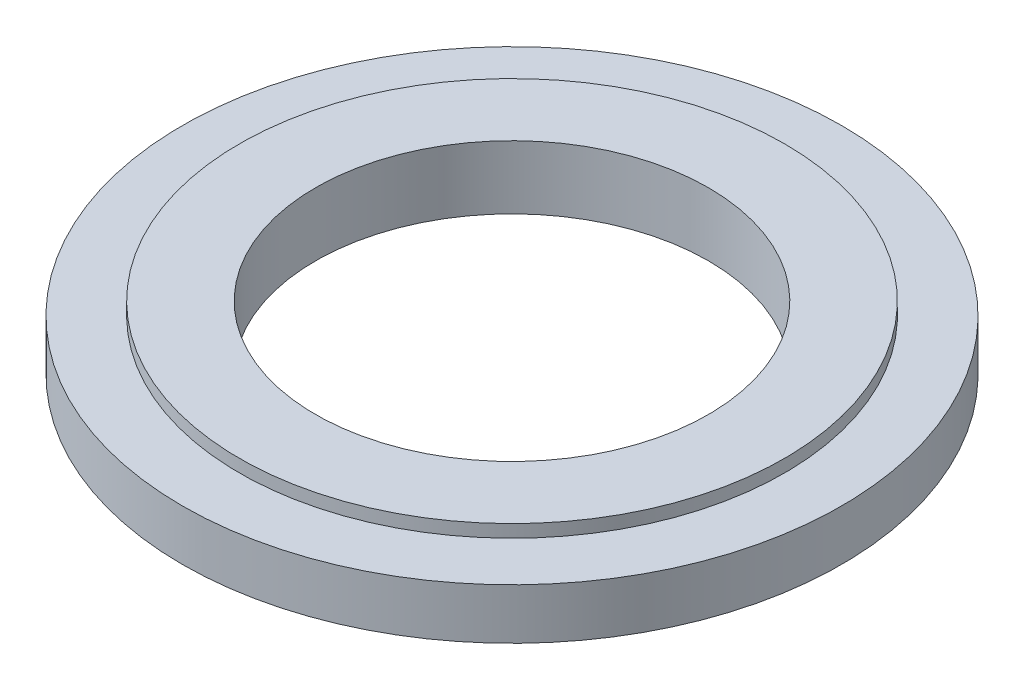
ISO-10303-21;
HEADER;
FILE_DESCRIPTION(('STEP AP214'),'2;1');
FILE_NAME('part.step','',(''),(''),'','','');
FILE_SCHEMA(('AUTOMOTIVE_DESIGN { 1 0 10303 214 1 1 1 1 }'));
ENDSEC;
DATA;
#1=APPLICATION_CONTEXT('core data for automotive mechanical design processes');
#2=APPLICATION_PROTOCOL_DEFINITION('international standard','automotive_design',2000,#1);
#3=PRODUCT_CONTEXT('',#1,'mechanical');
#4=PRODUCT('Part','Part','',(#3));
#5=PRODUCT_RELATED_PRODUCT_CATEGORY('part','',(#4));
#6=PRODUCT_DEFINITION_FORMATION('','',#4);
#7=PRODUCT_DEFINITION_CONTEXT('part definition',#1,'design');
#8=PRODUCT_DEFINITION('design','',#6,#7);
#9=PRODUCT_DEFINITION_SHAPE('','',#8);
#10=(LENGTH_UNIT() NAMED_UNIT(*) SI_UNIT(.MILLI.,.METRE.));
#11=(NAMED_UNIT(*) PLANE_ANGLE_UNIT() SI_UNIT($,.RADIAN.));
#12=(NAMED_UNIT(*) SI_UNIT($,.STERADIAN.) SOLID_ANGLE_UNIT());
#13=UNCERTAINTY_MEASURE_WITH_UNIT(LENGTH_MEASURE(1.E-05),#10,'distance_accuracy_value','');
#14=(GEOMETRIC_REPRESENTATION_CONTEXT(3) GLOBAL_UNCERTAINTY_ASSIGNED_CONTEXT((#13)) GLOBAL_UNIT_ASSIGNED_CONTEXT((#10,
#11,#12)) REPRESENTATION_CONTEXT('',''));
#15=CARTESIAN_POINT('',(0.,0.,0.));
#16=DIRECTION('',(0.,0.,1.));
#17=DIRECTION('',(1.,0.,0.));
#18=AXIS2_PLACEMENT_3D('',#15,#16,#17);
#19=CARTESIAN_POINT('',(0.,0.,0.));
#20=DIRECTION('',(0.,-1.,0.));
#21=DIRECTION('',(0.,0.,-1.));
#22=AXIS2_PLACEMENT_3D('',#19,#20,#21);
#23=CYLINDRICAL_SURFACE('',#22,7.75);
#24=CARTESIAN_POINT('',(0.,2.5,0.));
#25=DIRECTION('',(0.,-1.,0.));
#26=DIRECTION('',(0.,0.,-1.));
#27=AXIS2_PLACEMENT_3D('',#24,#25,#26);
#28=CIRCLE('',#27,7.75);
#29=CARTESIAN_POINT('',(0.,2.5,-7.75));
#30=VERTEX_POINT('',#29);
#31=EDGE_CURVE('E69',#30,#30,#28,.T.);
#32=ORIENTED_EDGE('',*,*,#31,.F.);
#33=EDGE_LOOP('',(#32));
#34=FACE_BOUND('',#33,.T.);
#35=CARTESIAN_POINT('',(0.,0.,0.));
#36=DIRECTION('',(0.,-1.,0.));
#37=DIRECTION('',(0.,0.,-1.));
#38=AXIS2_PLACEMENT_3D('',#35,#36,#37);
#39=CIRCLE('',#38,7.75);
#40=CARTESIAN_POINT('',(0.,0.,-7.75));
#41=VERTEX_POINT('',#40);
#42=EDGE_CURVE('E10',#41,#41,#39,.T.);
#43=ORIENTED_EDGE('',*,*,#42,.T.);
#44=EDGE_LOOP('',(#43));
#45=FACE_BOUND('',#44,.T.);
#46=ADVANCED_FACE('F41',(#34,#45),#23,.F.);
#47=CARTESIAN_POINT('',(-7.75,0.,0.));
#48=DIRECTION('',(0.,1.,0.));
#49=DIRECTION('',(0.,0.,1.));
#50=AXIS2_PLACEMENT_3D('',#47,#48,#49);
#51=PLANE('',#50);
#52=ORIENTED_EDGE('',*,*,#42,.F.);
#53=EDGE_LOOP('',(#52));
#54=FACE_BOUND('',#53,.T.);
#55=CARTESIAN_POINT('',(0.,0.,0.));
#56=DIRECTION('',(0.,-1.,0.));
#57=DIRECTION('',(0.,0.,-1.));
#58=AXIS2_PLACEMENT_3D('',#55,#56,#57);
#59=CIRCLE('',#58,13.);
#60=CARTESIAN_POINT('',(0.,0.,-13.));
#61=VERTEX_POINT('',#60);
#62=EDGE_CURVE('E48',#61,#61,#59,.T.);
#63=ORIENTED_EDGE('',*,*,#62,.T.);
#64=EDGE_LOOP('',(#63));
#65=FACE_BOUND('',#64,.T.);
#66=ADVANCED_FACE('F76',(#54,#65),#51,.F.);
#67=CARTESIAN_POINT('',(0.,0.,0.));
#68=DIRECTION('',(0.,-1.,0.));
#69=DIRECTION('',(0.,0.,-1.));
#70=AXIS2_PLACEMENT_3D('',#67,#68,#69);
#71=CYLINDRICAL_SURFACE('',#70,13.);
#72=ORIENTED_EDGE('',*,*,#62,.F.);
#73=EDGE_LOOP('',(#72));
#74=FACE_BOUND('',#73,.T.);
#75=CARTESIAN_POINT('',(0.,2.,0.));
#76=DIRECTION('',(0.,-1.,0.));
#77=DIRECTION('',(0.,0.,-1.));
#78=AXIS2_PLACEMENT_3D('',#75,#76,#77);
#79=CIRCLE('',#78,13.);
#80=CARTESIAN_POINT('',(0.,2.,-13.));
#81=VERTEX_POINT('',#80);
#82=EDGE_CURVE('E54',#81,#81,#79,.T.);
#83=ORIENTED_EDGE('',*,*,#82,.T.);
#84=EDGE_LOOP('',(#83));
#85=FACE_BOUND('',#84,.T.);
#86=ADVANCED_FACE('F80',(#74,#85),#71,.T.);
#87=CARTESIAN_POINT('',(-13.,2.,0.));
#88=DIRECTION('',(0.,-1.,0.));
#89=DIRECTION('',(0.,0.,-1.));
#90=AXIS2_PLACEMENT_3D('',#87,#88,#89);
#91=PLANE('',#90);
#92=ORIENTED_EDGE('',*,*,#82,.F.);
#93=EDGE_LOOP('',(#92));
#94=FACE_BOUND('',#93,.T.);
#95=CARTESIAN_POINT('',(0.,2.,0.));
#96=DIRECTION('',(0.,-1.,0.));
#97=DIRECTION('',(0.,0.,-1.));
#98=AXIS2_PLACEMENT_3D('',#95,#96,#97);
#99=CIRCLE('',#98,10.75);
#100=CARTESIAN_POINT('',(0.,2.,-10.75));
#101=VERTEX_POINT('',#100);
#102=EDGE_CURVE('E60',#101,#101,#99,.T.);
#103=ORIENTED_EDGE('',*,*,#102,.T.);
#104=EDGE_LOOP('',(#103));
#105=FACE_BOUND('',#104,.T.);
#106=ADVANCED_FACE('F85',(#94,#105),#91,.F.);
#107=CARTESIAN_POINT('',(0.,0.,0.));
#108=DIRECTION('',(0.,-1.,0.));
#109=DIRECTION('',(0.,0.,-1.));
#110=AXIS2_PLACEMENT_3D('',#107,#108,#109);
#111=CYLINDRICAL_SURFACE('',#110,10.75);
#112=ORIENTED_EDGE('',*,*,#102,.F.);
#113=EDGE_LOOP('',(#112));
#114=FACE_BOUND('',#113,.T.);
#115=CARTESIAN_POINT('',(0.,2.5,0.));
#116=DIRECTION('',(0.,-1.,0.));
#117=DIRECTION('',(0.,0.,-1.));
#118=AXIS2_PLACEMENT_3D('',#115,#116,#117);
#119=CIRCLE('',#118,10.75);
#120=CARTESIAN_POINT('',(0.,2.5,-10.75));
#121=VERTEX_POINT('',#120);
#122=EDGE_CURVE('E66',#121,#121,#119,.T.);
#123=ORIENTED_EDGE('',*,*,#122,.T.);
#124=EDGE_LOOP('',(#123));
#125=FACE_BOUND('',#124,.T.);
#126=ADVANCED_FACE('F91',(#114,#125),#111,.T.);
#127=CARTESIAN_POINT('',(-10.75,2.5,0.));
#128=DIRECTION('',(0.,-1.,0.));
#129=DIRECTION('',(0.,0.,-1.));
#130=AXIS2_PLACEMENT_3D('',#127,#128,#129);
#131=PLANE('',#130);
#132=ORIENTED_EDGE('',*,*,#122,.F.);
#133=EDGE_LOOP('',(#132));
#134=FACE_BOUND('',#133,.T.);
#135=ORIENTED_EDGE('',*,*,#31,.T.);
#136=EDGE_LOOP('',(#135));
#137=FACE_BOUND('',#136,.T.);
#138=ADVANCED_FACE('F73',(#134,#137),#131,.F.);
#139=CLOSED_SHELL('',(#46,#66,#86,#106,#126,#138));
#140=MANIFOLD_SOLID_BREP('B2',#139);
#141=ADVANCED_BREP_SHAPE_REPRESENTATION('',(#18,#140),#14);
#142=SHAPE_DEFINITION_REPRESENTATION(#9,#141);
ENDSEC;
END-ISO-10303-21;
